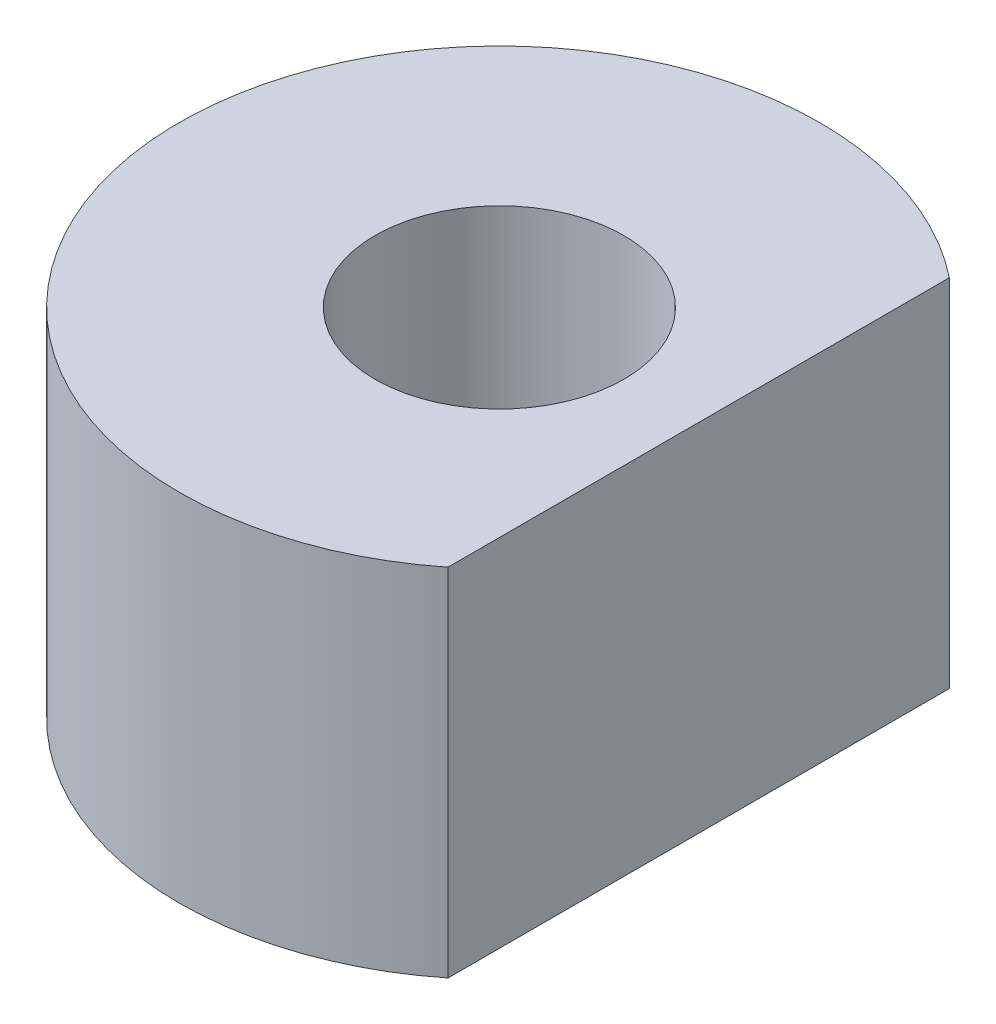
ISO-10303-21;
HEADER;
FILE_DESCRIPTION(('STEP AP214'),'2;1');
FILE_NAME('part.step','',(''),(''),'','','');
FILE_SCHEMA(('AUTOMOTIVE_DESIGN { 1 0 10303 214 1 1 1 1 }'));
ENDSEC;
DATA;
#1=APPLICATION_CONTEXT('core data for automotive mechanical design processes');
#2=APPLICATION_PROTOCOL_DEFINITION('international standard','automotive_design',2000,#1);
#3=PRODUCT_CONTEXT('',#1,'mechanical');
#4=PRODUCT('Part','Part','',(#3));
#5=PRODUCT_RELATED_PRODUCT_CATEGORY('part','',(#4));
#6=PRODUCT_DEFINITION_FORMATION('','',#4);
#7=PRODUCT_DEFINITION_CONTEXT('part definition',#1,'design');
#8=PRODUCT_DEFINITION('design','',#6,#7);
#9=PRODUCT_DEFINITION_SHAPE('','',#8);
#10=(LENGTH_UNIT() NAMED_UNIT(*) SI_UNIT(.MILLI.,.METRE.));
#11=(NAMED_UNIT(*) PLANE_ANGLE_UNIT() SI_UNIT($,.RADIAN.));
#12=(NAMED_UNIT(*) SI_UNIT($,.STERADIAN.) SOLID_ANGLE_UNIT());
#13=UNCERTAINTY_MEASURE_WITH_UNIT(LENGTH_MEASURE(1.E-05),#10,'distance_accuracy_value','');
#14=(GEOMETRIC_REPRESENTATION_CONTEXT(3) GLOBAL_UNCERTAINTY_ASSIGNED_CONTEXT((#13)) GLOBAL_UNIT_ASSIGNED_CONTEXT((#10,
#11,#12)) REPRESENTATION_CONTEXT('',''));
#15=CARTESIAN_POINT('',(0.,0.,0.));
#16=DIRECTION('',(0.,0.,1.));
#17=DIRECTION('',(1.,0.,0.));
#18=AXIS2_PLACEMENT_3D('',#15,#16,#17);
#19=CARTESIAN_POINT('',(2.8,5.,0.));
#20=DIRECTION('',(1.,0.,0.));
#21=DIRECTION('',(0.,0.,-1.));
#22=AXIS2_PLACEMENT_3D('',#19,#20,#21);
#23=PLANE('',#22);
#24=DIRECTION('',(0.,0.,1.));
#25=VECTOR('',#24,1.);
#26=CARTESIAN_POINT('',(2.8,0.,0.));
#27=LINE('',#26,#25);
#28=CARTESIAN_POINT('',(2.8,0.,-3.52278299076171));
#29=VERTEX_POINT('',#28);
#30=CARTESIAN_POINT('',(2.8,0.,3.52278299076171));
#31=VERTEX_POINT('',#30);
#32=EDGE_CURVE('E70',#29,#31,#27,.T.);
#33=ORIENTED_EDGE('',*,*,#32,.F.);
#34=DIRECTION('',(0.,-1.,0.));
#35=VECTOR('',#34,1.);
#36=CARTESIAN_POINT('',(2.8,5.,-3.52278299076171));
#37=LINE('',#36,#35);
#38=CARTESIAN_POINT('',(2.8,5.,-3.52278299076171));
#39=VERTEX_POINT('',#38);
#40=EDGE_CURVE('E11',#39,#29,#37,.T.);
#41=ORIENTED_EDGE('',*,*,#40,.F.);
#42=DIRECTION('',(0.,0.,1.));
#43=VECTOR('',#42,1.);
#44=CARTESIAN_POINT('',(2.8,5.,0.));
#45=LINE('',#44,#43);
#46=CARTESIAN_POINT('',(2.8,5.,3.52278299076171));
#47=VERTEX_POINT('',#46);
#48=EDGE_CURVE('E71',#39,#47,#45,.T.);
#49=ORIENTED_EDGE('',*,*,#48,.T.);
#50=DIRECTION('',(0.,-1.,0.));
#51=VECTOR('',#50,1.);
#52=CARTESIAN_POINT('',(2.8,5.,3.52278299076171));
#53=LINE('',#52,#51);
#54=EDGE_CURVE('E50',#47,#31,#53,.T.);
#55=ORIENTED_EDGE('',*,*,#54,.T.);
#56=EDGE_LOOP('',(#33,#41,#49,#55));
#57=FACE_BOUND('',#56,.T.);
#58=ADVANCED_FACE('F41',(#57),#23,.T.);
#59=CARTESIAN_POINT('',(0.,5.,0.));
#60=DIRECTION('',(0.,-1.,0.));
#61=DIRECTION('',(0.,0.,-1.));
#62=AXIS2_PLACEMENT_3D('',#59,#60,#61);
#63=CYLINDRICAL_SURFACE('',#62,1.75);
#64=CARTESIAN_POINT('',(0.,5.,0.));
#65=DIRECTION('',(0.,1.,0.));
#66=DIRECTION('',(0.,0.,1.));
#67=AXIS2_PLACEMENT_3D('',#64,#65,#66);
#68=CIRCLE('',#67,1.75);
#69=CARTESIAN_POINT('',(0.,5.,1.75));
#70=VERTEX_POINT('',#69);
#71=EDGE_CURVE('E75',#70,#70,#68,.T.);
#72=ORIENTED_EDGE('',*,*,#71,.T.);
#73=EDGE_LOOP('',(#72));
#74=FACE_BOUND('',#73,.T.);
#75=CARTESIAN_POINT('',(0.,0.,0.));
#76=DIRECTION('',(0.,1.,0.));
#77=DIRECTION('',(0.,0.,1.));
#78=AXIS2_PLACEMENT_3D('',#75,#76,#77);
#79=CIRCLE('',#78,1.75);
#80=CARTESIAN_POINT('',(0.,0.,1.75));
#81=VERTEX_POINT('',#80);
#82=EDGE_CURVE('E78',#81,#81,#79,.T.);
#83=ORIENTED_EDGE('',*,*,#82,.F.);
#84=EDGE_LOOP('',(#83));
#85=FACE_BOUND('',#84,.T.);
#86=ADVANCED_FACE('F43',(#74,#85),#63,.F.);
#87=CARTESIAN_POINT('',(0.,5.,0.));
#88=DIRECTION('',(0.,-1.,0.));
#89=DIRECTION('',(0.,0.,-1.));
#90=AXIS2_PLACEMENT_3D('',#87,#88,#89);
#91=CYLINDRICAL_SURFACE('',#90,4.5);
#92=CARTESIAN_POINT('',(0.,0.,0.));
#93=DIRECTION('',(0.,1.,0.));
#94=DIRECTION('',(0.,0.,1.));
#95=AXIS2_PLACEMENT_3D('',#92,#93,#94);
#96=CIRCLE('',#95,4.5);
#97=EDGE_CURVE('E72',#29,#31,#96,.T.);
#98=ORIENTED_EDGE('',*,*,#97,.T.);
#99=ORIENTED_EDGE('',*,*,#54,.F.);
#100=CARTESIAN_POINT('',(0.,5.,0.));
#101=DIRECTION('',(0.,1.,0.));
#102=DIRECTION('',(0.,0.,1.));
#103=AXIS2_PLACEMENT_3D('',#100,#101,#102);
#104=CIRCLE('',#103,4.5);
#105=EDGE_CURVE('E57',#39,#47,#104,.T.);
#106=ORIENTED_EDGE('',*,*,#105,.F.);
#107=ORIENTED_EDGE('',*,*,#40,.T.);
#108=EDGE_LOOP('',(#98,#99,#106,#107));
#109=FACE_BOUND('',#108,.T.);
#110=ADVANCED_FACE('F73',(#109),#91,.T.);
#111=CARTESIAN_POINT('',(0.,5.,0.));
#112=DIRECTION('',(0.,1.,0.));
#113=DIRECTION('',(0.,0.,1.));
#114=AXIS2_PLACEMENT_3D('',#111,#112,#113);
#115=PLANE('',#114);
#116=ORIENTED_EDGE('',*,*,#71,.F.);
#117=EDGE_LOOP('',(#116));
#118=FACE_BOUND('',#117,.T.);
#119=ORIENTED_EDGE('',*,*,#48,.F.);
#120=ORIENTED_EDGE('',*,*,#105,.T.);
#121=EDGE_LOOP('',(#119,#120));
#122=FACE_BOUND('',#121,.T.);
#123=ADVANCED_FACE('F90',(#118,#122),#115,.T.);
#124=CARTESIAN_POINT('',(0.,0.,0.));
#125=DIRECTION('',(0.,1.,0.));
#126=DIRECTION('',(0.,0.,1.));
#127=AXIS2_PLACEMENT_3D('',#124,#125,#126);
#128=PLANE('',#127);
#129=ORIENTED_EDGE('',*,*,#82,.T.);
#130=EDGE_LOOP('',(#129));
#131=FACE_BOUND('',#130,.T.);
#132=ORIENTED_EDGE('',*,*,#32,.T.);
#133=ORIENTED_EDGE('',*,*,#97,.F.);
#134=EDGE_LOOP('',(#132,#133));
#135=FACE_BOUND('',#134,.T.);
#136=ADVANCED_FACE('F77',(#131,#135),#128,.F.);
#137=CLOSED_SHELL('',(#58,#86,#110,#123,#136));
#138=MANIFOLD_SOLID_BREP('B2',#137);
#139=ADVANCED_BREP_SHAPE_REPRESENTATION('',(#18,#138),#14);
#140=SHAPE_DEFINITION_REPRESENTATION(#9,#139);
ENDSEC;
END-ISO-10303-21;
